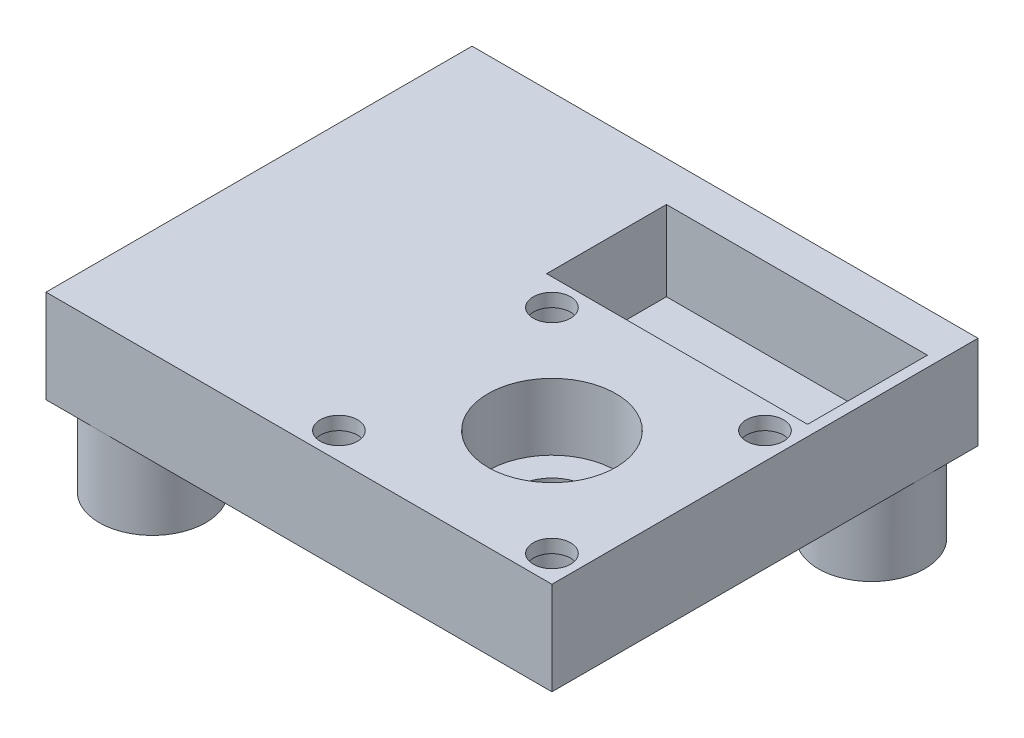
ISO-10303-21;
HEADER;
FILE_DESCRIPTION(('STEP AP214'),'2;1');
FILE_NAME('part.step','',(''),(''),'','','');
FILE_SCHEMA(('AUTOMOTIVE_DESIGN { 1 0 10303 214 1 1 1 1 }'));
ENDSEC;
DATA;
#1=APPLICATION_CONTEXT('core data for automotive mechanical design processes');
#2=APPLICATION_PROTOCOL_DEFINITION('international standard','automotive_design',2000,#1);
#3=PRODUCT_CONTEXT('',#1,'mechanical');
#4=PRODUCT('Part','Part','',(#3));
#5=PRODUCT_RELATED_PRODUCT_CATEGORY('part','',(#4));
#6=PRODUCT_DEFINITION_FORMATION('','',#4);
#7=PRODUCT_DEFINITION_CONTEXT('part definition',#1,'design');
#8=PRODUCT_DEFINITION('design','',#6,#7);
#9=PRODUCT_DEFINITION_SHAPE('','',#8);
#10=(LENGTH_UNIT() NAMED_UNIT(*) SI_UNIT(.MILLI.,.METRE.));
#11=(NAMED_UNIT(*) PLANE_ANGLE_UNIT() SI_UNIT($,.RADIAN.));
#12=(NAMED_UNIT(*) SI_UNIT($,.STERADIAN.) SOLID_ANGLE_UNIT());
#13=UNCERTAINTY_MEASURE_WITH_UNIT(LENGTH_MEASURE(1.E-05),#10,'distance_accuracy_value','');
#14=(GEOMETRIC_REPRESENTATION_CONTEXT(3) GLOBAL_UNCERTAINTY_ASSIGNED_CONTEXT((#13)) GLOBAL_UNIT_ASSIGNED_CONTEXT((#10,
#11,#12)) REPRESENTATION_CONTEXT('',''));
#15=CARTESIAN_POINT('',(0.,0.,0.));
#16=DIRECTION('',(0.,0.,1.));
#17=DIRECTION('',(1.,0.,0.));
#18=AXIS2_PLACEMENT_3D('',#15,#16,#17);
#19=CARTESIAN_POINT('',(0.,0.,0.));
#20=DIRECTION('',(0.,1.,0.));
#21=DIRECTION('',(0.,0.,1.));
#22=AXIS2_PLACEMENT_3D('',#19,#20,#21);
#23=PLANE('',#22);
#24=CARTESIAN_POINT('',(3.,0.,-9.));
#25=DIRECTION('',(0.,-1.,0.));
#26=DIRECTION('',(0.,0.,-1.));
#27=AXIS2_PLACEMENT_3D('',#24,#25,#26);
#28=CIRCLE('',#27,2.);
#29=CARTESIAN_POINT('',(3.,0.,-11.));
#30=VERTEX_POINT('',#29);
#31=CARTESIAN_POINT('',(5.,0.,-9.));
#32=VERTEX_POINT('',#31);
#33=EDGE_CURVE('E194',#30,#32,#28,.T.);
#34=ORIENTED_EDGE('',*,*,#33,.F.);
#35=DIRECTION('',(1.,0.,0.));
#36=VECTOR('',#35,1.);
#37=CARTESIAN_POINT('',(-5.,0.,-11.));
#38=LINE('',#37,#36);
#39=CARTESIAN_POINT('',(5.,0.,-11.));
#40=VERTEX_POINT('',#39);
#41=EDGE_CURVE('E181',#30,#40,#38,.T.);
#42=ORIENTED_EDGE('',*,*,#41,.T.);
#43=DIRECTION('',(0.,0.,1.));
#44=VECTOR('',#43,1.);
#45=CARTESIAN_POINT('',(5.,0.,-5.));
#46=LINE('',#45,#44);
#47=EDGE_CURVE('E195',#40,#32,#46,.T.);
#48=ORIENTED_EDGE('',*,*,#47,.T.);
#49=EDGE_LOOP('',(#34,#42,#48));
#50=FACE_BOUND('',#49,.T.);
#51=ADVANCED_FACE('F91',(#50),#23,.F.);
#52=CARTESIAN_POINT('',(-12.,0.,-9.));
#53=DIRECTION('',(0.,-1.,0.));
#54=DIRECTION('',(0.,0.,-1.));
#55=AXIS2_PLACEMENT_3D('',#52,#53,#54);
#56=CIRCLE('',#55,2.);
#57=CARTESIAN_POINT('',(-14.,0.,-9.));
#58=VERTEX_POINT('',#57);
#59=CARTESIAN_POINT('',(-12.,0.,-11.));
#60=VERTEX_POINT('',#59);
#61=EDGE_CURVE('E209',#58,#60,#56,.T.);
#62=ORIENTED_EDGE('',*,*,#61,.F.);
#63=DIRECTION('',(0.,0.,1.));
#64=VECTOR('',#63,1.);
#65=CARTESIAN_POINT('',(-14.,0.,-11.));
#66=LINE('',#65,#64);
#67=CARTESIAN_POINT('',(-14.,0.,-11.));
#68=VERTEX_POINT('',#67);
#69=EDGE_CURVE('E327',#68,#58,#66,.T.);
#70=ORIENTED_EDGE('',*,*,#69,.F.);
#71=EDGE_CURVE('E180',#68,#60,#38,.T.);
#72=ORIENTED_EDGE('',*,*,#71,.T.);
#73=EDGE_LOOP('',(#62,#70,#72));
#74=FACE_BOUND('',#73,.T.);
#75=ADVANCED_FACE('F400',(#74),#23,.F.);
#76=CARTESIAN_POINT('',(-12.,0.,3.));
#77=DIRECTION('',(0.,-1.,0.));
#78=DIRECTION('',(0.,0.,-1.));
#79=AXIS2_PLACEMENT_3D('',#76,#77,#78);
#80=CIRCLE('',#79,2.);
#81=CARTESIAN_POINT('',(-12.,0.,5.));
#82=VERTEX_POINT('',#81);
#83=CARTESIAN_POINT('',(-14.,0.,3.));
#84=VERTEX_POINT('',#83);
#85=EDGE_CURVE('E102',#82,#84,#80,.T.);
#86=ORIENTED_EDGE('',*,*,#85,.F.);
#87=DIRECTION('',(1.,0.,0.));
#88=VECTOR('',#87,1.);
#89=CARTESIAN_POINT('',(-5.,0.,5.));
#90=LINE('',#89,#88);
#91=CARTESIAN_POINT('',(-14.,0.,5.));
#92=VERTEX_POINT('',#91);
#93=EDGE_CURVE('E313',#92,#82,#90,.T.);
#94=ORIENTED_EDGE('',*,*,#93,.F.);
#95=EDGE_CURVE('E307',#84,#92,#66,.T.);
#96=ORIENTED_EDGE('',*,*,#95,.F.);
#97=EDGE_LOOP('',(#86,#94,#96));
#98=FACE_BOUND('',#97,.T.);
#99=ADVANCED_FACE('F380',(#98),#23,.F.);
#100=CARTESIAN_POINT('',(-3.9,3.5,-6.4));
#101=DIRECTION('',(0.,-1.,0.));
#102=DIRECTION('',(0.,0.,-1.));
#103=AXIS2_PLACEMENT_3D('',#100,#101,#102);
#104=CYLINDRICAL_SURFACE('',#103,1.25);
#105=CARTESIAN_POINT('',(-3.9,0.,-6.4));
#106=DIRECTION('',(0.,1.,0.));
#107=DIRECTION('',(0.,0.,1.));
#108=AXIS2_PLACEMENT_3D('',#105,#106,#107);
#109=CIRCLE('',#108,1.25);
#110=CARTESIAN_POINT('',(-3.9,0.,-5.15));
#111=VERTEX_POINT('',#110);
#112=EDGE_CURVE('E254',#111,#111,#109,.T.);
#113=ORIENTED_EDGE('',*,*,#112,.F.);
#114=EDGE_LOOP('',(#113));
#115=FACE_BOUND('',#114,.T.);
#116=CARTESIAN_POINT('',(-3.9,0.5,-6.4));
#117=DIRECTION('',(0.,1.,0.));
#118=DIRECTION('',(0.,0.,1.));
#119=AXIS2_PLACEMENT_3D('',#116,#117,#118);
#120=CIRCLE('',#119,1.25);
#121=CARTESIAN_POINT('',(-3.9,0.5,-5.15));
#122=VERTEX_POINT('',#121);
#123=EDGE_CURVE('E95',#122,#122,#120,.T.);
#124=ORIENTED_EDGE('',*,*,#123,.T.);
#125=EDGE_LOOP('',(#124));
#126=FACE_BOUND('',#125,.T.);
#127=ADVANCED_FACE('F412',(#115,#126),#104,.F.);
#128=CARTESIAN_POINT('',(0.,3.5,0.));
#129=DIRECTION('',(0.,-1.,0.));
#130=DIRECTION('',(0.,0.,-1.));
#131=AXIS2_PLACEMENT_3D('',#128,#129,#130);
#132=CYLINDRICAL_SURFACE('',#131,1.35);
#133=CARTESIAN_POINT('',(0.,0.,0.));
#134=DIRECTION('',(0.,1.,0.));
#135=DIRECTION('',(0.,0.,1.));
#136=AXIS2_PLACEMENT_3D('',#133,#134,#135);
#137=CIRCLE('',#136,1.35);
#138=CARTESIAN_POINT('',(0.,0.,1.35));
#139=VERTEX_POINT('',#138);
#140=EDGE_CURVE('E302',#139,#139,#137,.T.);
#141=ORIENTED_EDGE('',*,*,#140,.F.);
#142=EDGE_LOOP('',(#141));
#143=FACE_BOUND('',#142,.T.);
#144=CARTESIAN_POINT('',(0.,1.,0.));
#145=DIRECTION('',(0.,1.,0.));
#146=DIRECTION('',(0.,0.,1.));
#147=AXIS2_PLACEMENT_3D('',#144,#145,#146);
#148=CIRCLE('',#147,1.35);
#149=CARTESIAN_POINT('',(0.,1.,1.35));
#150=VERTEX_POINT('',#149);
#151=EDGE_CURVE('E295',#150,#150,#148,.T.);
#152=ORIENTED_EDGE('',*,*,#151,.T.);
#153=EDGE_LOOP('',(#152));
#154=FACE_BOUND('',#153,.T.);
#155=ADVANCED_FACE('F416',(#143,#154),#132,.F.);
#156=CARTESIAN_POINT('',(-5.,3.5,5.));
#157=DIRECTION('',(0.,0.,-1.));
#158=DIRECTION('',(-1.,0.,0.));
#159=AXIS2_PLACEMENT_3D('',#156,#157,#158);
#160=PLANE('',#159);
#161=ORIENTED_EDGE('',*,*,#93,.T.);
#162=CARTESIAN_POINT('',(5.,0.,5.));
#163=VERTEX_POINT('',#162);
#164=EDGE_CURVE('E316',#82,#163,#90,.T.);
#165=ORIENTED_EDGE('',*,*,#164,.T.);
#166=DIRECTION('',(0.,-1.,0.));
#167=VECTOR('',#166,1.);
#168=CARTESIAN_POINT('',(5.,3.5,5.));
#169=LINE('',#168,#167);
#170=CARTESIAN_POINT('',(5.,3.5,5.));
#171=VERTEX_POINT('',#170);
#172=EDGE_CURVE('E100',#171,#163,#169,.T.);
#173=ORIENTED_EDGE('',*,*,#172,.F.);
#174=DIRECTION('',(1.,0.,0.));
#175=VECTOR('',#174,1.);
#176=CARTESIAN_POINT('',(-5.,3.5,5.));
#177=LINE('',#176,#175);
#178=CARTESIAN_POINT('',(-14.,3.5,5.));
#179=VERTEX_POINT('',#178);
#180=EDGE_CURVE('E308',#179,#171,#177,.T.);
#181=ORIENTED_EDGE('',*,*,#180,.F.);
#182=DIRECTION('',(0.,-1.,0.));
#183=VECTOR('',#182,1.);
#184=CARTESIAN_POINT('',(-14.,3.5,5.));
#185=LINE('',#184,#183);
#186=EDGE_CURVE('E192',#179,#92,#185,.T.);
#187=ORIENTED_EDGE('',*,*,#186,.T.);
#188=EDGE_LOOP('',(#161,#165,#173,#181,#187));
#189=FACE_BOUND('',#188,.T.);
#190=ADVANCED_FACE('F371',(#189),#160,.F.);
#191=CARTESIAN_POINT('',(5.,3.5,-5.));
#192=DIRECTION('',(1.,0.,0.));
#193=DIRECTION('',(0.,0.,-1.));
#194=AXIS2_PLACEMENT_3D('',#191,#192,#193);
#195=PLANE('',#194);
#196=ORIENTED_EDGE('',*,*,#47,.F.);
#197=DIRECTION('',(0.,-1.,0.));
#198=VECTOR('',#197,1.);
#199=CARTESIAN_POINT('',(5.,3.5,-11.));
#200=LINE('',#199,#198);
#201=CARTESIAN_POINT('',(5.,3.5,-11.));
#202=VERTEX_POINT('',#201);
#203=EDGE_CURVE('E188',#202,#40,#200,.T.);
#204=ORIENTED_EDGE('',*,*,#203,.F.);
#205=DIRECTION('',(0.,0.,1.));
#206=VECTOR('',#205,1.);
#207=CARTESIAN_POINT('',(5.,3.5,-5.));
#208=LINE('',#207,#206);
#209=EDGE_CURVE('E310',#202,#171,#208,.T.);
#210=ORIENTED_EDGE('',*,*,#209,.T.);
#211=ORIENTED_EDGE('',*,*,#172,.T.);
#212=EDGE_CURVE('E315',#32,#163,#46,.T.);
#213=ORIENTED_EDGE('',*,*,#212,.F.);
#214=EDGE_LOOP('',(#196,#204,#210,#211,#213));
#215=FACE_BOUND('',#214,.T.);
#216=ADVANCED_FACE('F376',(#215),#195,.T.);
#217=EDGE_CURVE('E109',#32,#30,#28,.T.);
#218=ORIENTED_EDGE('',*,*,#217,.F.);
#219=ORIENTED_EDGE('',*,*,#212,.T.);
#220=ORIENTED_EDGE('',*,*,#164,.F.);
#221=EDGE_CURVE('E12',#84,#82,#80,.T.);
#222=ORIENTED_EDGE('',*,*,#221,.F.);
#223=EDGE_CURVE('E329',#58,#84,#66,.T.);
#224=ORIENTED_EDGE('',*,*,#223,.F.);
#225=EDGE_CURVE('E115',#60,#58,#56,.T.);
#226=ORIENTED_EDGE('',*,*,#225,.F.);
#227=EDGE_CURVE('E174',#60,#30,#38,.T.);
#228=ORIENTED_EDGE('',*,*,#227,.T.);
#229=EDGE_LOOP('',(#218,#219,#220,#222,#224,#226,#228));
#230=FACE_BOUND('',#229,.T.);
#231=CARTESIAN_POINT('',(-8.10714951623889,0.,-2.55423701354193));
#232=DIRECTION('',(0.,-1.,0.));
#233=DIRECTION('',(0.,0.,-1.));
#234=AXIS2_PLACEMENT_3D('',#231,#232,#233);
#235=CIRCLE('',#234,1.05);
#236=CARTESIAN_POINT('',(-8.10714951623889,0.,-3.60423701354193));
#237=VERTEX_POINT('',#236);
#238=EDGE_CURVE('E214',#237,#237,#235,.T.);
#239=ORIENTED_EDGE('',*,*,#238,.F.);
#240=EDGE_LOOP('',(#239));
#241=FACE_BOUND('',#240,.T.);
#242=ORIENTED_EDGE('',*,*,#112,.T.);
#243=EDGE_LOOP('',(#242));
#244=FACE_BOUND('',#243,.T.);
#245=CARTESIAN_POINT('',(-4.,0.,-4.));
#246=DIRECTION('',(0.,1.,0.));
#247=DIRECTION('',(0.,0.,1.));
#248=AXIS2_PLACEMENT_3D('',#245,#246,#247);
#249=CIRCLE('',#248,0.950000000000001);
#250=CARTESIAN_POINT('',(-4.,0.,-3.05));
#251=VERTEX_POINT('',#250);
#252=EDGE_CURVE('E271',#251,#251,#249,.T.);
#253=ORIENTED_EDGE('',*,*,#252,.T.);
#254=EDGE_LOOP('',(#253));
#255=FACE_BOUND('',#254,.T.);
#256=CARTESIAN_POINT('',(4.,0.,-4.));
#257=DIRECTION('',(0.,1.,0.));
#258=DIRECTION('',(0.,0.,1.));
#259=AXIS2_PLACEMENT_3D('',#256,#257,#258);
#260=CIRCLE('',#259,0.95);
#261=CARTESIAN_POINT('',(4.,0.,-3.05));
#262=VERTEX_POINT('',#261);
#263=EDGE_CURVE('E265',#262,#262,#260,.T.);
#264=ORIENTED_EDGE('',*,*,#263,.T.);
#265=EDGE_LOOP('',(#264));
#266=FACE_BOUND('',#265,.T.);
#267=CARTESIAN_POINT('',(4.,0.,4.));
#268=DIRECTION('',(0.,1.,0.));
#269=DIRECTION('',(0.,0.,1.));
#270=AXIS2_PLACEMENT_3D('',#267,#268,#269);
#271=CIRCLE('',#270,0.949999999999999);
#272=CARTESIAN_POINT('',(4.,0.,4.95));
#273=VERTEX_POINT('',#272);
#274=EDGE_CURVE('E258',#273,#273,#271,.T.);
#275=ORIENTED_EDGE('',*,*,#274,.T.);
#276=EDGE_LOOP('',(#275));
#277=FACE_BOUND('',#276,.T.);
#278=CARTESIAN_POINT('',(-4.,0.,4.));
#279=DIRECTION('',(0.,1.,0.));
#280=DIRECTION('',(0.,0.,1.));
#281=AXIS2_PLACEMENT_3D('',#278,#279,#280);
#282=CIRCLE('',#281,0.95);
#283=CARTESIAN_POINT('',(-4.,0.,4.95));
#284=VERTEX_POINT('',#283);
#285=EDGE_CURVE('E261',#284,#284,#282,.T.);
#286=ORIENTED_EDGE('',*,*,#285,.T.);
#287=EDGE_LOOP('',(#286));
#288=FACE_BOUND('',#287,.T.);
#289=ORIENTED_EDGE('',*,*,#140,.T.);
#290=EDGE_LOOP('',(#289));
#291=FACE_BOUND('',#290,.T.);
#292=ADVANCED_FACE('F176',(#230,#241,#244,#255,#266,#277,#288,#291),#23,.F.);
#293=CARTESIAN_POINT('',(0.,3.5,0.));
#294=DIRECTION('',(0.,1.,0.));
#295=DIRECTION('',(0.,0.,1.));
#296=AXIS2_PLACEMENT_3D('',#293,#294,#295);
#297=PLANE('',#296);
#298=DIRECTION('',(0.,0.,1.));
#299=VECTOR('',#298,1.);
#300=CARTESIAN_POINT('',(-5.2,3.5,-9.5));
#301=LINE('',#300,#299);
#302=CARTESIAN_POINT('',(-5.2,3.5,-9.5));
#303=VERTEX_POINT('',#302);
#304=CARTESIAN_POINT('',(-5.2,3.5,-5.));
#305=VERTEX_POINT('',#304);
#306=EDGE_CURVE('E220',#303,#305,#301,.T.);
#307=ORIENTED_EDGE('',*,*,#306,.F.);
#308=DIRECTION('',(-1.,0.,0.));
#309=VECTOR('',#308,1.);
#310=CARTESIAN_POINT('',(-5.2,3.5,-9.5));
#311=LINE('',#310,#309);
#312=CARTESIAN_POINT('',(4.6,3.5,-9.5));
#313=VERTEX_POINT('',#312);
#314=EDGE_CURVE('E227',#313,#303,#311,.T.);
#315=ORIENTED_EDGE('',*,*,#314,.F.);
#316=DIRECTION('',(0.,0.,-1.));
#317=VECTOR('',#316,1.);
#318=CARTESIAN_POINT('',(4.6,3.5,-9.5));
#319=LINE('',#318,#317);
#320=CARTESIAN_POINT('',(4.6,3.5,-5.));
#321=VERTEX_POINT('',#320);
#322=EDGE_CURVE('E241',#321,#313,#319,.T.);
#323=ORIENTED_EDGE('',*,*,#322,.F.);
#324=DIRECTION('',(1.,0.,0.));
#325=VECTOR('',#324,1.);
#326=CARTESIAN_POINT('',(-5.2,3.5,-5.));
#327=LINE('',#326,#325);
#328=EDGE_CURVE('E238',#305,#321,#327,.T.);
#329=ORIENTED_EDGE('',*,*,#328,.F.);
#330=EDGE_LOOP('',(#307,#315,#323,#329));
#331=FACE_BOUND('',#330,.T.);
#332=CARTESIAN_POINT('',(4.,3.5,-4.));
#333=DIRECTION('',(0.,1.,0.));
#334=DIRECTION('',(0.,0.,1.));
#335=AXIS2_PLACEMENT_3D('',#332,#333,#334);
#336=CIRCLE('',#335,0.7);
#337=CARTESIAN_POINT('',(4.,3.5,-3.3));
#338=VERTEX_POINT('',#337);
#339=EDGE_CURVE('E287',#338,#338,#336,.T.);
#340=ORIENTED_EDGE('',*,*,#339,.F.);
#341=EDGE_LOOP('',(#340));
#342=FACE_BOUND('',#341,.T.);
#343=CARTESIAN_POINT('',(-4.,3.5,4.));
#344=DIRECTION('',(0.,1.,0.));
#345=DIRECTION('',(0.,0.,1.));
#346=AXIS2_PLACEMENT_3D('',#343,#344,#345);
#347=CIRCLE('',#346,0.7);
#348=CARTESIAN_POINT('',(-4.,3.5,4.7));
#349=VERTEX_POINT('',#348);
#350=EDGE_CURVE('E285',#349,#349,#347,.T.);
#351=ORIENTED_EDGE('',*,*,#350,.F.);
#352=EDGE_LOOP('',(#351));
#353=FACE_BOUND('',#352,.T.);
#354=CARTESIAN_POINT('',(4.,3.5,4.));
#355=DIRECTION('',(0.,1.,0.));
#356=DIRECTION('',(0.,0.,1.));
#357=AXIS2_PLACEMENT_3D('',#354,#355,#356);
#358=CIRCLE('',#357,0.7);
#359=CARTESIAN_POINT('',(4.,3.5,4.7));
#360=VERTEX_POINT('',#359);
#361=EDGE_CURVE('E282',#360,#360,#358,.T.);
#362=ORIENTED_EDGE('',*,*,#361,.F.);
#363=EDGE_LOOP('',(#362));
#364=FACE_BOUND('',#363,.T.);
#365=CARTESIAN_POINT('',(-4.,3.5,-4.));
#366=DIRECTION('',(0.,1.,0.));
#367=DIRECTION('',(0.,0.,1.));
#368=AXIS2_PLACEMENT_3D('',#365,#366,#367);
#369=CIRCLE('',#368,0.7);
#370=CARTESIAN_POINT('',(-4.,3.5,-3.3));
#371=VERTEX_POINT('',#370);
#372=EDGE_CURVE('E290',#371,#371,#369,.T.);
#373=ORIENTED_EDGE('',*,*,#372,.F.);
#374=EDGE_LOOP('',(#373));
#375=FACE_BOUND('',#374,.T.);
#376=CARTESIAN_POINT('',(0.,3.5,0.));
#377=DIRECTION('',(0.,1.,0.));
#378=DIRECTION('',(0.,0.,1.));
#379=AXIS2_PLACEMENT_3D('',#376,#377,#378);
#380=CIRCLE('',#379,2.4);
#381=CARTESIAN_POINT('',(0.,3.5,2.4));
#382=VERTEX_POINT('',#381);
#383=EDGE_CURVE('E298',#382,#382,#380,.T.);
#384=ORIENTED_EDGE('',*,*,#383,.F.);
#385=EDGE_LOOP('',(#384));
#386=FACE_BOUND('',#385,.T.);
#387=DIRECTION('',(1.,0.,0.));
#388=VECTOR('',#387,1.);
#389=CARTESIAN_POINT('',(-5.,3.5,-11.));
#390=LINE('',#389,#388);
#391=CARTESIAN_POINT('',(-14.,3.5,-11.));
#392=VERTEX_POINT('',#391);
#393=EDGE_CURVE('E320',#392,#202,#390,.T.);
#394=ORIENTED_EDGE('',*,*,#393,.F.);
#395=DIRECTION('',(0.,0.,1.));
#396=VECTOR('',#395,1.);
#397=CARTESIAN_POINT('',(-14.,3.5,-11.));
#398=LINE('',#397,#396);
#399=EDGE_CURVE('E323',#392,#179,#398,.T.);
#400=ORIENTED_EDGE('',*,*,#399,.T.);
#401=ORIENTED_EDGE('',*,*,#180,.T.);
#402=ORIENTED_EDGE('',*,*,#209,.F.);
#403=EDGE_LOOP('',(#394,#400,#401,#402));
#404=FACE_BOUND('',#403,.T.);
#405=ADVANCED_FACE('F355',(#331,#342,#353,#364,#375,#386,#404),#297,.T.);
#406=CARTESIAN_POINT('',(-5.,3.5,-11.));
#407=DIRECTION('',(0.,0.,-1.));
#408=DIRECTION('',(-1.,0.,0.));
#409=AXIS2_PLACEMENT_3D('',#406,#407,#408);
#410=PLANE('',#409);
#411=ORIENTED_EDGE('',*,*,#71,.F.);
#412=DIRECTION('',(0.,-1.,0.));
#413=VECTOR('',#412,1.);
#414=CARTESIAN_POINT('',(-14.,3.5,-11.));
#415=LINE('',#414,#413);
#416=EDGE_CURVE('E326',#392,#68,#415,.T.);
#417=ORIENTED_EDGE('',*,*,#416,.F.);
#418=ORIENTED_EDGE('',*,*,#393,.T.);
#419=ORIENTED_EDGE('',*,*,#203,.T.);
#420=ORIENTED_EDGE('',*,*,#41,.F.);
#421=ORIENTED_EDGE('',*,*,#227,.F.);
#422=EDGE_LOOP('',(#411,#417,#418,#419,#420,#421));
#423=FACE_BOUND('',#422,.T.);
#424=ADVANCED_FACE('F185',(#423),#410,.T.);
#425=CARTESIAN_POINT('',(-14.,3.5,-11.));
#426=DIRECTION('',(1.,0.,0.));
#427=DIRECTION('',(0.,0.,-1.));
#428=AXIS2_PLACEMENT_3D('',#425,#426,#427);
#429=PLANE('',#428);
#430=ORIENTED_EDGE('',*,*,#69,.T.);
#431=ORIENTED_EDGE('',*,*,#223,.T.);
#432=ORIENTED_EDGE('',*,*,#95,.T.);
#433=ORIENTED_EDGE('',*,*,#186,.F.);
#434=ORIENTED_EDGE('',*,*,#399,.F.);
#435=ORIENTED_EDGE('',*,*,#416,.T.);
#436=EDGE_LOOP('',(#430,#431,#432,#433,#434,#435));
#437=FACE_BOUND('',#436,.T.);
#438=ADVANCED_FACE('F93',(#437),#429,.F.);
#439=CARTESIAN_POINT('',(0.,1.,0.));
#440=DIRECTION('',(0.,1.,0.));
#441=DIRECTION('',(0.,0.,1.));
#442=AXIS2_PLACEMENT_3D('',#439,#440,#441);
#443=CYLINDRICAL_SURFACE('',#442,2.4);
#444=CARTESIAN_POINT('',(0.,1.,0.));
#445=DIRECTION('',(0.,1.,0.));
#446=DIRECTION('',(0.,0.,1.));
#447=AXIS2_PLACEMENT_3D('',#444,#445,#446);
#448=CIRCLE('',#447,2.4);
#449=CARTESIAN_POINT('',(0.,1.,2.4));
#450=VERTEX_POINT('',#449);
#451=EDGE_CURVE('E299',#450,#450,#448,.T.);
#452=ORIENTED_EDGE('',*,*,#451,.F.);
#453=EDGE_LOOP('',(#452));
#454=FACE_BOUND('',#453,.T.);
#455=ORIENTED_EDGE('',*,*,#383,.T.);
#456=EDGE_LOOP('',(#455));
#457=FACE_BOUND('',#456,.T.);
#458=ADVANCED_FACE('F360',(#454,#457),#443,.F.);
#459=CARTESIAN_POINT('',(0.,1.,0.));
#460=DIRECTION('',(0.,1.,0.));
#461=DIRECTION('',(0.,0.,1.));
#462=AXIS2_PLACEMENT_3D('',#459,#460,#461);
#463=PLANE('',#462);
#464=ORIENTED_EDGE('',*,*,#151,.F.);
#465=EDGE_LOOP('',(#464));
#466=FACE_BOUND('',#465,.T.);
#467=ORIENTED_EDGE('',*,*,#451,.T.);
#468=EDGE_LOOP('',(#467));
#469=FACE_BOUND('',#468,.T.);
#470=ADVANCED_FACE('F351',(#466,#469),#463,.T.);
#471=CARTESIAN_POINT('',(-4.,3.5,-4.));
#472=DIRECTION('',(0.,-1.,0.));
#473=DIRECTION('',(0.,0.,-1.));
#474=AXIS2_PLACEMENT_3D('',#471,#472,#473);
#475=CYLINDRICAL_SURFACE('',#474,0.7);
#476=CARTESIAN_POINT('',(-4.,3.,-4.));
#477=DIRECTION('',(0.,1.,0.));
#478=DIRECTION('',(0.,0.,1.));
#479=AXIS2_PLACEMENT_3D('',#476,#477,#478);
#480=CIRCLE('',#479,0.7);
#481=CARTESIAN_POINT('',(-4.,3.,-3.3));
#482=VERTEX_POINT('',#481);
#483=EDGE_CURVE('E286',#482,#482,#480,.T.);
#484=ORIENTED_EDGE('',*,*,#483,.F.);
#485=EDGE_LOOP('',(#484));
#486=FACE_BOUND('',#485,.T.);
#487=ORIENTED_EDGE('',*,*,#372,.T.);
#488=EDGE_LOOP('',(#487));
#489=FACE_BOUND('',#488,.T.);
#490=ADVANCED_FACE('F347',(#486,#489),#475,.F.);
#491=CARTESIAN_POINT('',(4.,3.5,4.));
#492=DIRECTION('',(0.,-1.,0.));
#493=DIRECTION('',(0.,0.,-1.));
#494=AXIS2_PLACEMENT_3D('',#491,#492,#493);
#495=CYLINDRICAL_SURFACE('',#494,0.7);
#496=CARTESIAN_POINT('',(4.,3.,4.));
#497=DIRECTION('',(0.,1.,0.));
#498=DIRECTION('',(0.,0.,1.));
#499=AXIS2_PLACEMENT_3D('',#496,#497,#498);
#500=CIRCLE('',#499,0.7);
#501=CARTESIAN_POINT('',(4.,3.,4.7));
#502=VERTEX_POINT('',#501);
#503=EDGE_CURVE('E339',#502,#502,#500,.T.);
#504=ORIENTED_EDGE('',*,*,#503,.F.);
#505=EDGE_LOOP('',(#504));
#506=FACE_BOUND('',#505,.T.);
#507=ORIENTED_EDGE('',*,*,#361,.T.);
#508=EDGE_LOOP('',(#507));
#509=FACE_BOUND('',#508,.T.);
#510=ADVANCED_FACE('F350',(#506,#509),#495,.F.);
#511=CARTESIAN_POINT('',(-4.,3.5,4.));
#512=DIRECTION('',(0.,-1.,0.));
#513=DIRECTION('',(0.,0.,-1.));
#514=AXIS2_PLACEMENT_3D('',#511,#512,#513);
#515=CYLINDRICAL_SURFACE('',#514,0.7);
#516=CARTESIAN_POINT('',(-4.,3.,4.));
#517=DIRECTION('',(0.,1.,0.));
#518=DIRECTION('',(0.,0.,1.));
#519=AXIS2_PLACEMENT_3D('',#516,#517,#518);
#520=CIRCLE('',#519,0.7);
#521=CARTESIAN_POINT('',(-4.,3.,4.7));
#522=VERTEX_POINT('',#521);
#523=EDGE_CURVE('E336',#522,#522,#520,.T.);
#524=ORIENTED_EDGE('',*,*,#523,.F.);
#525=EDGE_LOOP('',(#524));
#526=FACE_BOUND('',#525,.T.);
#527=ORIENTED_EDGE('',*,*,#350,.T.);
#528=EDGE_LOOP('',(#527));
#529=FACE_BOUND('',#528,.T.);
#530=ADVANCED_FACE('F463',(#526,#529),#515,.F.);
#531=CARTESIAN_POINT('',(4.,3.5,-4.));
#532=DIRECTION('',(0.,-1.,0.));
#533=DIRECTION('',(0.,0.,-1.));
#534=AXIS2_PLACEMENT_3D('',#531,#532,#533);
#535=CYLINDRICAL_SURFACE('',#534,0.7);
#536=CARTESIAN_POINT('',(4.,3.,-4.));
#537=DIRECTION('',(0.,1.,0.));
#538=DIRECTION('',(0.,0.,1.));
#539=AXIS2_PLACEMENT_3D('',#536,#537,#538);
#540=CIRCLE('',#539,0.7);
#541=CARTESIAN_POINT('',(4.,3.,-3.3));
#542=VERTEX_POINT('',#541);
#543=EDGE_CURVE('E279',#542,#542,#540,.T.);
#544=ORIENTED_EDGE('',*,*,#543,.F.);
#545=EDGE_LOOP('',(#544));
#546=FACE_BOUND('',#545,.T.);
#547=ORIENTED_EDGE('',*,*,#339,.T.);
#548=EDGE_LOOP('',(#547));
#549=FACE_BOUND('',#548,.T.);
#550=ADVANCED_FACE('F444',(#546,#549),#535,.F.);
#551=CARTESIAN_POINT('',(4.,3.,-4.));
#552=DIRECTION('',(0.,-1.,0.));
#553=DIRECTION('',(0.,0.,-1.));
#554=AXIS2_PLACEMENT_3D('',#551,#552,#553);
#555=CYLINDRICAL_SURFACE('',#554,0.95);
#556=CARTESIAN_POINT('',(4.,3.,-4.));
#557=DIRECTION('',(0.,1.,0.));
#558=DIRECTION('',(0.,0.,1.));
#559=AXIS2_PLACEMENT_3D('',#556,#557,#558);
#560=CIRCLE('',#559,0.95);
#561=CARTESIAN_POINT('',(4.,3.,-3.05));
#562=VERTEX_POINT('',#561);
#563=EDGE_CURVE('E268',#562,#562,#560,.T.);
#564=ORIENTED_EDGE('',*,*,#563,.T.);
#565=EDGE_LOOP('',(#564));
#566=FACE_BOUND('',#565,.T.);
#567=ORIENTED_EDGE('',*,*,#263,.F.);
#568=EDGE_LOOP('',(#567));
#569=FACE_BOUND('',#568,.T.);
#570=ADVANCED_FACE('F440',(#566,#569),#555,.F.);
#571=CARTESIAN_POINT('',(4.,3.,-4.));
#572=DIRECTION('',(0.,1.,0.));
#573=DIRECTION('',(0.,0.,1.));
#574=AXIS2_PLACEMENT_3D('',#571,#572,#573);
#575=PLANE('',#574);
#576=ORIENTED_EDGE('',*,*,#543,.T.);
#577=EDGE_LOOP('',(#576));
#578=FACE_BOUND('',#577,.T.);
#579=ORIENTED_EDGE('',*,*,#563,.F.);
#580=EDGE_LOOP('',(#579));
#581=FACE_BOUND('',#580,.T.);
#582=ADVANCED_FACE('F443',(#578,#581),#575,.F.);
#583=CARTESIAN_POINT('',(-4.,3.,4.));
#584=DIRECTION('',(0.,-1.,0.));
#585=DIRECTION('',(0.,0.,-1.));
#586=AXIS2_PLACEMENT_3D('',#583,#584,#585);
#587=CYLINDRICAL_SURFACE('',#586,0.95);
#588=CARTESIAN_POINT('',(-4.,3.,4.));
#589=DIRECTION('',(0.,1.,0.));
#590=DIRECTION('',(0.,0.,1.));
#591=AXIS2_PLACEMENT_3D('',#588,#589,#590);
#592=CIRCLE('',#591,0.95);
#593=CARTESIAN_POINT('',(-4.,3.,4.95));
#594=VERTEX_POINT('',#593);
#595=EDGE_CURVE('E276',#594,#594,#592,.T.);
#596=ORIENTED_EDGE('',*,*,#595,.T.);
#597=EDGE_LOOP('',(#596));
#598=FACE_BOUND('',#597,.T.);
#599=ORIENTED_EDGE('',*,*,#285,.F.);
#600=EDGE_LOOP('',(#599));
#601=FACE_BOUND('',#600,.T.);
#602=ADVANCED_FACE('F448',(#598,#601),#587,.F.);
#603=CARTESIAN_POINT('',(-4.,3.,4.));
#604=DIRECTION('',(0.,1.,0.));
#605=DIRECTION('',(0.,0.,1.));
#606=AXIS2_PLACEMENT_3D('',#603,#604,#605);
#607=PLANE('',#606);
#608=ORIENTED_EDGE('',*,*,#523,.T.);
#609=EDGE_LOOP('',(#608));
#610=FACE_BOUND('',#609,.T.);
#611=ORIENTED_EDGE('',*,*,#595,.F.);
#612=EDGE_LOOP('',(#611));
#613=FACE_BOUND('',#612,.T.);
#614=ADVANCED_FACE('F434',(#610,#613),#607,.F.);
#615=CARTESIAN_POINT('',(4.,3.,4.));
#616=DIRECTION('',(0.,-1.,0.));
#617=DIRECTION('',(0.,0.,-1.));
#618=AXIS2_PLACEMENT_3D('',#615,#616,#617);
#619=CYLINDRICAL_SURFACE('',#618,0.949999999999999);
#620=CARTESIAN_POINT('',(4.,3.,4.));
#621=DIRECTION('',(0.,1.,0.));
#622=DIRECTION('',(0.,0.,1.));
#623=AXIS2_PLACEMENT_3D('',#620,#621,#622);
#624=CIRCLE('',#623,0.949999999999999);
#625=CARTESIAN_POINT('',(4.,3.,4.95));
#626=VERTEX_POINT('',#625);
#627=EDGE_CURVE('E262',#626,#626,#624,.T.);
#628=ORIENTED_EDGE('',*,*,#627,.T.);
#629=EDGE_LOOP('',(#628));
#630=FACE_BOUND('',#629,.T.);
#631=ORIENTED_EDGE('',*,*,#274,.F.);
#632=EDGE_LOOP('',(#631));
#633=FACE_BOUND('',#632,.T.);
#634=ADVANCED_FACE('F430',(#630,#633),#619,.F.);
#635=CARTESIAN_POINT('',(4.,3.,4.));
#636=DIRECTION('',(0.,1.,0.));
#637=DIRECTION('',(0.,0.,1.));
#638=AXIS2_PLACEMENT_3D('',#635,#636,#637);
#639=PLANE('',#638);
#640=ORIENTED_EDGE('',*,*,#503,.T.);
#641=EDGE_LOOP('',(#640));
#642=FACE_BOUND('',#641,.T.);
#643=ORIENTED_EDGE('',*,*,#627,.F.);
#644=EDGE_LOOP('',(#643));
#645=FACE_BOUND('',#644,.T.);
#646=ADVANCED_FACE('F433',(#642,#645),#639,.F.);
#647=CARTESIAN_POINT('',(-4.,3.,-4.));
#648=DIRECTION('',(0.,-1.,0.));
#649=DIRECTION('',(0.,0.,-1.));
#650=AXIS2_PLACEMENT_3D('',#647,#648,#649);
#651=CYLINDRICAL_SURFACE('',#650,0.950000000000001);
#652=CARTESIAN_POINT('',(-4.,3.,-4.));
#653=DIRECTION('',(0.,1.,0.));
#654=DIRECTION('',(0.,0.,1.));
#655=AXIS2_PLACEMENT_3D('',#652,#653,#654);
#656=CIRCLE('',#655,0.950000000000001);
#657=CARTESIAN_POINT('',(-4.,3.,-3.05));
#658=VERTEX_POINT('',#657);
#659=EDGE_CURVE('E257',#658,#658,#656,.T.);
#660=ORIENTED_EDGE('',*,*,#659,.T.);
#661=EDGE_LOOP('',(#660));
#662=FACE_BOUND('',#661,.T.);
#663=ORIENTED_EDGE('',*,*,#252,.F.);
#664=EDGE_LOOP('',(#663));
#665=FACE_BOUND('',#664,.T.);
#666=ADVANCED_FACE('F438',(#662,#665),#651,.F.);
#667=CARTESIAN_POINT('',(-4.,3.,-4.));
#668=DIRECTION('',(0.,1.,0.));
#669=DIRECTION('',(0.,0.,1.));
#670=AXIS2_PLACEMENT_3D('',#667,#668,#669);
#671=PLANE('',#670);
#672=ORIENTED_EDGE('',*,*,#483,.T.);
#673=EDGE_LOOP('',(#672));
#674=FACE_BOUND('',#673,.T.);
#675=ORIENTED_EDGE('',*,*,#659,.F.);
#676=EDGE_LOOP('',(#675));
#677=FACE_BOUND('',#676,.T.);
#678=ADVANCED_FACE('F344',(#674,#677),#671,.F.);
#679=CARTESIAN_POINT('',(-5.2,0.5,-9.5));
#680=DIRECTION('',(-1.,0.,0.));
#681=DIRECTION('',(0.,0.,1.));
#682=AXIS2_PLACEMENT_3D('',#679,#680,#681);
#683=PLANE('',#682);
#684=ORIENTED_EDGE('',*,*,#306,.T.);
#685=DIRECTION('',(0.,1.,0.));
#686=VECTOR('',#685,1.);
#687=CARTESIAN_POINT('',(-5.2,0.5,-5.));
#688=LINE('',#687,#686);
#689=CARTESIAN_POINT('',(-5.2,0.5,-5.));
#690=VERTEX_POINT('',#689);
#691=EDGE_CURVE('E236',#690,#305,#688,.T.);
#692=ORIENTED_EDGE('',*,*,#691,.F.);
#693=DIRECTION('',(0.,0.,1.));
#694=VECTOR('',#693,1.);
#695=CARTESIAN_POINT('',(-5.2,0.5,-9.5));
#696=LINE('',#695,#694);
#697=CARTESIAN_POINT('',(-5.2,0.5,-9.5));
#698=VERTEX_POINT('',#697);
#699=EDGE_CURVE('E223',#698,#690,#696,.T.);
#700=ORIENTED_EDGE('',*,*,#699,.F.);
#701=DIRECTION('',(0.,1.,0.));
#702=VECTOR('',#701,1.);
#703=CARTESIAN_POINT('',(-5.2,0.5,-9.5));
#704=LINE('',#703,#702);
#705=EDGE_CURVE('E246',#698,#303,#704,.T.);
#706=ORIENTED_EDGE('',*,*,#705,.T.);
#707=EDGE_LOOP('',(#684,#692,#700,#706));
#708=FACE_BOUND('',#707,.T.);
#709=ADVANCED_FACE('F428',(#708),#683,.F.);
#710=CARTESIAN_POINT('',(-5.2,0.5,-9.5));
#711=DIRECTION('',(0.,0.,-1.));
#712=DIRECTION('',(-1.,0.,0.));
#713=AXIS2_PLACEMENT_3D('',#710,#711,#712);
#714=PLANE('',#713);
#715=ORIENTED_EDGE('',*,*,#314,.T.);
#716=ORIENTED_EDGE('',*,*,#705,.F.);
#717=DIRECTION('',(-1.,0.,0.));
#718=VECTOR('',#717,1.);
#719=CARTESIAN_POINT('',(-5.2,0.5,-9.5));
#720=LINE('',#719,#718);
#721=CARTESIAN_POINT('',(4.6,0.5,-9.5));
#722=VERTEX_POINT('',#721);
#723=EDGE_CURVE('E233',#722,#698,#720,.T.);
#724=ORIENTED_EDGE('',*,*,#723,.F.);
#725=DIRECTION('',(0.,1.,0.));
#726=VECTOR('',#725,1.);
#727=CARTESIAN_POINT('',(4.6,0.5,-9.5));
#728=LINE('',#727,#726);
#729=EDGE_CURVE('E248',#722,#313,#728,.T.);
#730=ORIENTED_EDGE('',*,*,#729,.T.);
#731=EDGE_LOOP('',(#715,#716,#724,#730));
#732=FACE_BOUND('',#731,.T.);
#733=ADVANCED_FACE('F706',(#732),#714,.F.);
#734=CARTESIAN_POINT('',(4.6,0.5,-9.5));
#735=DIRECTION('',(1.,0.,0.));
#736=DIRECTION('',(0.,0.,-1.));
#737=AXIS2_PLACEMENT_3D('',#734,#735,#736);
#738=PLANE('',#737);
#739=ORIENTED_EDGE('',*,*,#322,.T.);
#740=ORIENTED_EDGE('',*,*,#729,.F.);
#741=DIRECTION('',(0.,0.,-1.));
#742=VECTOR('',#741,1.);
#743=CARTESIAN_POINT('',(4.6,0.5,-9.5));
#744=LINE('',#743,#742);
#745=CARTESIAN_POINT('',(4.6,0.5,-5.));
#746=VERTEX_POINT('',#745);
#747=EDGE_CURVE('E230',#746,#722,#744,.T.);
#748=ORIENTED_EDGE('',*,*,#747,.F.);
#749=DIRECTION('',(0.,1.,0.));
#750=VECTOR('',#749,1.);
#751=CARTESIAN_POINT('',(4.6,0.5,-5.));
#752=LINE('',#751,#750);
#753=EDGE_CURVE('E250',#746,#321,#752,.T.);
#754=ORIENTED_EDGE('',*,*,#753,.T.);
#755=EDGE_LOOP('',(#739,#740,#748,#754));
#756=FACE_BOUND('',#755,.T.);
#757=ADVANCED_FACE('F698',(#756),#738,.F.);
#758=CARTESIAN_POINT('',(-5.2,0.5,-5.));
#759=DIRECTION('',(0.,0.,1.));
#760=DIRECTION('',(1.,0.,0.));
#761=AXIS2_PLACEMENT_3D('',#758,#759,#760);
#762=PLANE('',#761);
#763=ORIENTED_EDGE('',*,*,#328,.T.);
#764=ORIENTED_EDGE('',*,*,#753,.F.);
#765=DIRECTION('',(1.,0.,0.));
#766=VECTOR('',#765,1.);
#767=CARTESIAN_POINT('',(-5.2,0.5,-5.));
#768=LINE('',#767,#766);
#769=EDGE_CURVE('E226',#690,#746,#768,.T.);
#770=ORIENTED_EDGE('',*,*,#769,.F.);
#771=ORIENTED_EDGE('',*,*,#691,.T.);
#772=EDGE_LOOP('',(#763,#764,#770,#771));
#773=FACE_BOUND('',#772,.T.);
#774=ADVANCED_FACE('F689',(#773),#762,.F.);
#775=CARTESIAN_POINT('',(0.,0.5,0.));
#776=DIRECTION('',(0.,1.,0.));
#777=DIRECTION('',(0.,0.,1.));
#778=AXIS2_PLACEMENT_3D('',#775,#776,#777);
#779=PLANE('',#778);
#780=ORIENTED_EDGE('',*,*,#123,.F.);
#781=EDGE_LOOP('',(#780));
#782=FACE_BOUND('',#781,.T.);
#783=ORIENTED_EDGE('',*,*,#699,.T.);
#784=ORIENTED_EDGE('',*,*,#769,.T.);
#785=ORIENTED_EDGE('',*,*,#747,.T.);
#786=ORIENTED_EDGE('',*,*,#723,.T.);
#787=EDGE_LOOP('',(#783,#784,#785,#786));
#788=FACE_BOUND('',#787,.T.);
#789=ADVANCED_FACE('F680',(#782,#788),#779,.T.);
#790=CARTESIAN_POINT('',(-8.10714951623889,2.8,-2.55423701354193));
#791=DIRECTION('',(0.,-1.,0.));
#792=DIRECTION('',(0.,0.,-1.));
#793=AXIS2_PLACEMENT_3D('',#790,#791,#792);
#794=CYLINDRICAL_SURFACE('',#793,1.05);
#795=CARTESIAN_POINT('',(-8.10714951623889,2.8,-2.55423701354193));
#796=DIRECTION('',(0.,-1.,0.));
#797=DIRECTION('',(0.,0.,-1.));
#798=AXIS2_PLACEMENT_3D('',#795,#796,#797);
#799=CIRCLE('',#798,1.05);
#800=CARTESIAN_POINT('',(-8.10714951623889,2.8,-3.60423701354193));
#801=VERTEX_POINT('',#800);
#802=EDGE_CURVE('E217',#801,#801,#799,.T.);
#803=ORIENTED_EDGE('',*,*,#802,.F.);
#804=EDGE_LOOP('',(#803));
#805=FACE_BOUND('',#804,.T.);
#806=ORIENTED_EDGE('',*,*,#238,.T.);
#807=EDGE_LOOP('',(#806));
#808=FACE_BOUND('',#807,.T.);
#809=ADVANCED_FACE('F395',(#805,#808),#794,.F.);
#810=CARTESIAN_POINT('',(-8.10714951623889,2.8,-2.55423701354193));
#811=DIRECTION('',(0.,-1.,0.));
#812=DIRECTION('',(0.,0.,-1.));
#813=AXIS2_PLACEMENT_3D('',#810,#811,#812);
#814=PLANE('',#813);
#815=ORIENTED_EDGE('',*,*,#802,.T.);
#816=EDGE_LOOP('',(#815));
#817=FACE_BOUND('',#816,.T.);
#818=ADVANCED_FACE('F385',(#817),#814,.T.);
#819=CARTESIAN_POINT('',(-12.,-3.,3.));
#820=DIRECTION('',(0.,1.,0.));
#821=DIRECTION('',(0.,0.,1.));
#822=AXIS2_PLACEMENT_3D('',#819,#820,#821);
#823=CYLINDRICAL_SURFACE('',#822,2.);
#824=CARTESIAN_POINT('',(-12.,-3.,3.));
#825=DIRECTION('',(0.,-1.,0.));
#826=DIRECTION('',(0.,0.,-1.));
#827=AXIS2_PLACEMENT_3D('',#824,#825,#826);
#828=CIRCLE('',#827,2.);
#829=CARTESIAN_POINT('',(-12.,-3.,1.));
#830=VERTEX_POINT('',#829);
#831=EDGE_CURVE('E212',#830,#830,#828,.T.);
#832=ORIENTED_EDGE('',*,*,#831,.F.);
#833=EDGE_LOOP('',(#832));
#834=FACE_BOUND('',#833,.T.);
#835=ORIENTED_EDGE('',*,*,#85,.T.);
#836=ORIENTED_EDGE('',*,*,#221,.T.);
#837=EDGE_LOOP('',(#835,#836));
#838=FACE_BOUND('',#837,.T.);
#839=ADVANCED_FACE('F382',(#834,#838),#823,.T.);
#840=CARTESIAN_POINT('',(-12.,-3.,3.));
#841=DIRECTION('',(0.,-1.,0.));
#842=DIRECTION('',(0.,0.,-1.));
#843=AXIS2_PLACEMENT_3D('',#840,#841,#842);
#844=PLANE('',#843);
#845=CARTESIAN_POINT('',(-12.,-3.,3.));
#846=DIRECTION('',(0.,-1.,0.));
#847=DIRECTION('',(0.,0.,-1.));
#848=AXIS2_PLACEMENT_3D('',#845,#846,#847);
#849=CIRCLE('',#848,0.3);
#850=CARTESIAN_POINT('',(-12.,-3.,2.7));
#851=VERTEX_POINT('',#850);
#852=EDGE_CURVE('E629',#851,#851,#849,.T.);
#853=ORIENTED_EDGE('',*,*,#852,.F.);
#854=EDGE_LOOP('',(#853));
#855=FACE_BOUND('',#854,.T.);
#856=ORIENTED_EDGE('',*,*,#831,.T.);
#857=EDGE_LOOP('',(#856));
#858=FACE_BOUND('',#857,.T.);
#859=ADVANCED_FACE('F384',(#855,#858),#844,.T.);
#860=CARTESIAN_POINT('',(-12.,-3.,-9.));
#861=DIRECTION('',(0.,1.,0.));
#862=DIRECTION('',(0.,0.,1.));
#863=AXIS2_PLACEMENT_3D('',#860,#861,#862);
#864=CYLINDRICAL_SURFACE('',#863,2.);
#865=CARTESIAN_POINT('',(-12.,-3.,-9.));
#866=DIRECTION('',(0.,-1.,0.));
#867=DIRECTION('',(0.,0.,-1.));
#868=AXIS2_PLACEMENT_3D('',#865,#866,#867);
#869=CIRCLE('',#868,2.);
#870=CARTESIAN_POINT('',(-12.,-3.,-11.));
#871=VERTEX_POINT('',#870);
#872=EDGE_CURVE('E197',#871,#871,#869,.T.);
#873=ORIENTED_EDGE('',*,*,#872,.F.);
#874=EDGE_LOOP('',(#873));
#875=FACE_BOUND('',#874,.T.);
#876=ORIENTED_EDGE('',*,*,#225,.T.);
#877=ORIENTED_EDGE('',*,*,#61,.T.);
#878=EDGE_LOOP('',(#876,#877));
#879=FACE_BOUND('',#878,.T.);
#880=ADVANCED_FACE('F392',(#875,#879),#864,.T.);
#881=CARTESIAN_POINT('',(-12.,-3.,-9.));
#882=DIRECTION('',(0.,-1.,0.));
#883=DIRECTION('',(0.,0.,-1.));
#884=AXIS2_PLACEMENT_3D('',#881,#882,#883);
#885=PLANE('',#884);
#886=CARTESIAN_POINT('',(-12.,-3.,-9.));
#887=DIRECTION('',(0.,-1.,0.));
#888=DIRECTION('',(0.,0.,-1.));
#889=AXIS2_PLACEMENT_3D('',#886,#887,#888);
#890=CIRCLE('',#889,0.3);
#891=CARTESIAN_POINT('',(-12.,-3.,-9.3));
#892=VERTEX_POINT('',#891);
#893=EDGE_CURVE('E205',#892,#892,#890,.T.);
#894=ORIENTED_EDGE('',*,*,#893,.F.);
#895=EDGE_LOOP('',(#894));
#896=FACE_BOUND('',#895,.T.);
#897=ORIENTED_EDGE('',*,*,#872,.T.);
#898=EDGE_LOOP('',(#897));
#899=FACE_BOUND('',#898,.T.);
#900=ADVANCED_FACE('F528',(#896,#899),#885,.T.);
#901=CARTESIAN_POINT('',(3.,-3.,-9.));
#902=DIRECTION('',(0.,1.,0.));
#903=DIRECTION('',(0.,0.,1.));
#904=AXIS2_PLACEMENT_3D('',#901,#902,#903);
#905=CYLINDRICAL_SURFACE('',#904,2.);
#906=CARTESIAN_POINT('',(3.,-3.,-9.));
#907=DIRECTION('',(0.,-1.,0.));
#908=DIRECTION('',(0.,0.,-1.));
#909=AXIS2_PLACEMENT_3D('',#906,#907,#908);
#910=CIRCLE('',#909,2.);
#911=CARTESIAN_POINT('',(3.,-3.,-11.));
#912=VERTEX_POINT('',#911);
#913=EDGE_CURVE('E200',#912,#912,#910,.T.);
#914=ORIENTED_EDGE('',*,*,#913,.F.);
#915=EDGE_LOOP('',(#914));
#916=FACE_BOUND('',#915,.T.);
#917=ORIENTED_EDGE('',*,*,#33,.T.);
#918=ORIENTED_EDGE('',*,*,#217,.T.);
#919=EDGE_LOOP('',(#917,#918));
#920=FACE_BOUND('',#919,.T.);
#921=ADVANCED_FACE('F199',(#916,#920),#905,.T.);
#922=CARTESIAN_POINT('',(3.,-3.,-9.));
#923=DIRECTION('',(0.,-1.,0.));
#924=DIRECTION('',(0.,0.,-1.));
#925=AXIS2_PLACEMENT_3D('',#922,#923,#924);
#926=PLANE('',#925);
#927=CARTESIAN_POINT('',(3.,-3.,-9.));
#928=DIRECTION('',(0.,-1.,0.));
#929=DIRECTION('',(0.,0.,-1.));
#930=AXIS2_PLACEMENT_3D('',#927,#928,#929);
#931=CIRCLE('',#930,0.3);
#932=CARTESIAN_POINT('',(3.,-3.,-9.3));
#933=VERTEX_POINT('',#932);
#934=EDGE_CURVE('E630',#933,#933,#931,.T.);
#935=ORIENTED_EDGE('',*,*,#934,.F.);
#936=EDGE_LOOP('',(#935));
#937=FACE_BOUND('',#936,.T.);
#938=ORIENTED_EDGE('',*,*,#913,.T.);
#939=EDGE_LOOP('',(#938));
#940=FACE_BOUND('',#939,.T.);
#941=ADVANCED_FACE('F540',(#937,#940),#926,.T.);
#942=CARTESIAN_POINT('',(3.,-1.5,-9.));
#943=DIRECTION('',(0.,-1.,0.));
#944=DIRECTION('',(0.,0.,-1.));
#945=AXIS2_PLACEMENT_3D('',#942,#943,#944);
#946=CYLINDRICAL_SURFACE('',#945,0.3);
#947=CARTESIAN_POINT('',(3.,-1.5,-9.));
#948=DIRECTION('',(0.,-1.,0.));
#949=DIRECTION('',(0.,0.,-1.));
#950=AXIS2_PLACEMENT_3D('',#947,#948,#949);
#951=CIRCLE('',#950,0.3);
#952=CARTESIAN_POINT('',(3.,-1.5,-9.3));
#953=VERTEX_POINT('',#952);
#954=EDGE_CURVE('E635',#953,#953,#951,.T.);
#955=ORIENTED_EDGE('',*,*,#954,.F.);
#956=EDGE_LOOP('',(#955));
#957=FACE_BOUND('',#956,.T.);
#958=ORIENTED_EDGE('',*,*,#934,.T.);
#959=EDGE_LOOP('',(#958));
#960=FACE_BOUND('',#959,.T.);
#961=ADVANCED_FACE('F562',(#957,#960),#946,.F.);
#962=CARTESIAN_POINT('',(3.,-1.5,-9.));
#963=DIRECTION('',(0.,-1.,0.));
#964=DIRECTION('',(0.,0.,-1.));
#965=AXIS2_PLACEMENT_3D('',#962,#963,#964);
#966=PLANE('',#965);
#967=ORIENTED_EDGE('',*,*,#954,.T.);
#968=EDGE_LOOP('',(#967));
#969=FACE_BOUND('',#968,.T.);
#970=ADVANCED_FACE('F572',(#969),#966,.T.);
#971=CARTESIAN_POINT('',(-12.,-1.5,-9.));
#972=DIRECTION('',(0.,-1.,0.));
#973=DIRECTION('',(0.,0.,-1.));
#974=AXIS2_PLACEMENT_3D('',#971,#972,#973);
#975=CYLINDRICAL_SURFACE('',#974,0.3);
#976=CARTESIAN_POINT('',(-12.,-1.5,-9.));
#977=DIRECTION('',(0.,-1.,0.));
#978=DIRECTION('',(0.,0.,-1.));
#979=AXIS2_PLACEMENT_3D('',#976,#977,#978);
#980=CIRCLE('',#979,0.3);
#981=CARTESIAN_POINT('',(-12.,-1.5,-9.3));
#982=VERTEX_POINT('',#981);
#983=EDGE_CURVE('E202',#982,#982,#980,.T.);
#984=ORIENTED_EDGE('',*,*,#983,.F.);
#985=EDGE_LOOP('',(#984));
#986=FACE_BOUND('',#985,.T.);
#987=ORIENTED_EDGE('',*,*,#893,.T.);
#988=EDGE_LOOP('',(#987));
#989=FACE_BOUND('',#988,.T.);
#990=ADVANCED_FACE('F582',(#986,#989),#975,.F.);
#991=CARTESIAN_POINT('',(-12.,-1.5,-9.));
#992=DIRECTION('',(0.,-1.,0.));
#993=DIRECTION('',(0.,0.,-1.));
#994=AXIS2_PLACEMENT_3D('',#991,#992,#993);
#995=PLANE('',#994);
#996=ORIENTED_EDGE('',*,*,#983,.T.);
#997=EDGE_LOOP('',(#996));
#998=FACE_BOUND('',#997,.T.);
#999=ADVANCED_FACE('F592',(#998),#995,.T.);
#1000=CARTESIAN_POINT('',(-12.,-1.5,3.));
#1001=DIRECTION('',(0.,-1.,0.));
#1002=DIRECTION('',(0.,0.,-1.));
#1003=AXIS2_PLACEMENT_3D('',#1000,#1001,#1002);
#1004=CYLINDRICAL_SURFACE('',#1003,0.3);
#1005=CARTESIAN_POINT('',(-12.,-1.5,3.));
#1006=DIRECTION('',(0.,-1.,0.));
#1007=DIRECTION('',(0.,0.,-1.));
#1008=AXIS2_PLACEMENT_3D('',#1005,#1006,#1007);
#1009=CIRCLE('',#1008,0.3);
#1010=CARTESIAN_POINT('',(-12.,-1.5,2.7));
#1011=VERTEX_POINT('',#1010);
#1012=EDGE_CURVE('E628',#1011,#1011,#1009,.T.);
#1013=ORIENTED_EDGE('',*,*,#1012,.F.);
#1014=EDGE_LOOP('',(#1013));
#1015=FACE_BOUND('',#1014,.T.);
#1016=ORIENTED_EDGE('',*,*,#852,.T.);
#1017=EDGE_LOOP('',(#1016));
#1018=FACE_BOUND('',#1017,.T.);
#1019=ADVANCED_FACE('F602',(#1015,#1018),#1004,.F.);
#1020=CARTESIAN_POINT('',(-12.,-1.5,3.));
#1021=DIRECTION('',(0.,-1.,0.));
#1022=DIRECTION('',(0.,0.,-1.));
#1023=AXIS2_PLACEMENT_3D('',#1020,#1021,#1022);
#1024=PLANE('',#1023);
#1025=ORIENTED_EDGE('',*,*,#1012,.T.);
#1026=EDGE_LOOP('',(#1025));
#1027=FACE_BOUND('',#1026,.T.);
#1028=ADVANCED_FACE('F612',(#1027),#1024,.T.);
#1029=CLOSED_SHELL('',(#51,#75,#99,#127,#155,#190,#216,#292,#405,#424,#438,#458,#470,#490,#510,
#530,#550,#570,#582,#602,#614,#634,#646,#666,#678,#709,#733,#757,#774,#789,#809,#818,#839,#859,
#880,#900,#921,#941,#961,#970,#990,#999,#1019,#1028));
#1030=MANIFOLD_SOLID_BREP('B2',#1029);
#1031=ADVANCED_BREP_SHAPE_REPRESENTATION('',(#18,#1030),#14);
#1032=SHAPE_DEFINITION_REPRESENTATION(#9,#1031);
ENDSEC;
END-ISO-10303-21;
